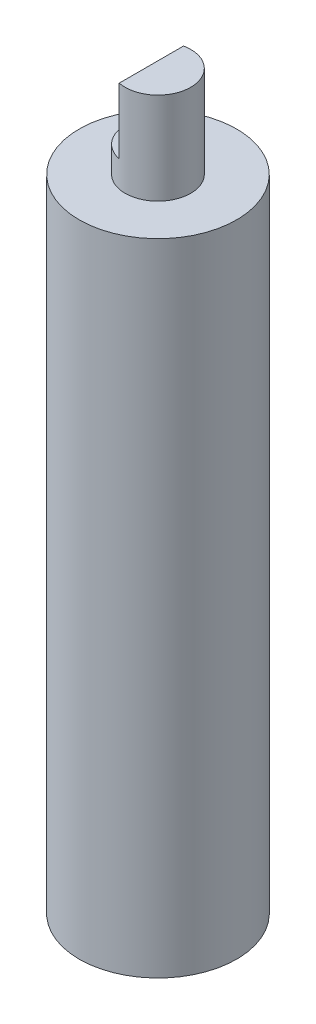
ISO-10303-21;
HEADER;
FILE_DESCRIPTION(('STEP AP214'),'2;1');
FILE_NAME('part.step','',(''),(''),'','','');
FILE_SCHEMA(('AUTOMOTIVE_DESIGN { 1 0 10303 214 1 1 1 1 }'));
ENDSEC;
DATA;
#1=APPLICATION_CONTEXT('core data for automotive mechanical design processes');
#2=APPLICATION_PROTOCOL_DEFINITION('international standard','automotive_design',2000,#1);
#3=PRODUCT_CONTEXT('',#1,'mechanical');
#4=PRODUCT('Part','Part','',(#3));
#5=PRODUCT_RELATED_PRODUCT_CATEGORY('part','',(#4));
#6=PRODUCT_DEFINITION_FORMATION('','',#4);
#7=PRODUCT_DEFINITION_CONTEXT('part definition',#1,'design');
#8=PRODUCT_DEFINITION('design','',#6,#7);
#9=PRODUCT_DEFINITION_SHAPE('','',#8);
#10=(LENGTH_UNIT() NAMED_UNIT(*) SI_UNIT(.MILLI.,.METRE.));
#11=(NAMED_UNIT(*) PLANE_ANGLE_UNIT() SI_UNIT($,.RADIAN.));
#12=(NAMED_UNIT(*) SI_UNIT($,.STERADIAN.) SOLID_ANGLE_UNIT());
#13=UNCERTAINTY_MEASURE_WITH_UNIT(LENGTH_MEASURE(1.E-05),#10,'distance_accuracy_value','');
#14=(GEOMETRIC_REPRESENTATION_CONTEXT(3) GLOBAL_UNCERTAINTY_ASSIGNED_CONTEXT((#13)) GLOBAL_UNIT_ASSIGNED_CONTEXT((#10,
#11,#12)) REPRESENTATION_CONTEXT('',''));
#15=CARTESIAN_POINT('',(0.,0.,0.));
#16=DIRECTION('',(0.,0.,1.));
#17=DIRECTION('',(1.,0.,0.));
#18=AXIS2_PLACEMENT_3D('',#15,#16,#17);
#19=CARTESIAN_POINT('',(0.,42.9,-23.8716187755818));
#20=DIRECTION('',(0.,-1.,0.));
#21=DIRECTION('',(0.,0.,-1.));
#22=AXIS2_PLACEMENT_3D('',#19,#20,#21);
#23=PLANE('',#22);
#24=CARTESIAN_POINT('',(0.,42.9,-22.6216187755818));
#25=DIRECTION('',(0.,1.,0.));
#26=DIRECTION('',(0.,0.,1.));
#27=AXIS2_PLACEMENT_3D('',#24,#25,#26);
#28=CIRCLE('',#27,1.25);
#29=CARTESIAN_POINT('',(-0.249999999999995,42.9,-21.3968739041902));
#30=VERTEX_POINT('',#29);
#31=CARTESIAN_POINT('',(-0.249999999999996,42.9,-23.8463636469734));
#32=VERTEX_POINT('',#31);
#33=EDGE_CURVE('E83',#30,#32,#28,.T.);
#34=ORIENTED_EDGE('',*,*,#33,.T.);
#35=DIRECTION('',(0.,0.,-1.));
#36=VECTOR('',#35,1.);
#37=CARTESIAN_POINT('',(-0.249999999999996,42.9,-23.8463636469734));
#38=LINE('',#37,#36);
#39=EDGE_CURVE('E74',#30,#32,#38,.T.);
#40=ORIENTED_EDGE('',*,*,#39,.F.);
#41=EDGE_LOOP('',(#34,#40));
#42=FACE_BOUND('',#41,.T.);
#43=ADVANCED_FACE('F45',(#42),#23,.F.);
#44=CARTESIAN_POINT('',(0.,15.,-22.6216187755818));
#45=DIRECTION('',(0.,1.,0.));
#46=DIRECTION('',(0.,0.,1.));
#47=AXIS2_PLACEMENT_3D('',#44,#45,#46);
#48=PLANE('',#47);
#49=CARTESIAN_POINT('',(0.,15.,-22.6216187755818));
#50=DIRECTION('',(0.,1.,0.));
#51=DIRECTION('',(0.,0.,1.));
#52=AXIS2_PLACEMENT_3D('',#49,#50,#51);
#53=CIRCLE('',#52,3.);
#54=CARTESIAN_POINT('',(0.,15.,-19.6216187755818));
#55=VERTEX_POINT('',#54);
#56=EDGE_CURVE('E11',#55,#55,#53,.T.);
#57=ORIENTED_EDGE('',*,*,#56,.F.);
#58=EDGE_LOOP('',(#57));
#59=FACE_BOUND('',#58,.T.);
#60=ADVANCED_FACE('F105',(#59),#48,.F.);
#61=CARTESIAN_POINT('',(0.,42.9,-22.6216187755818));
#62=DIRECTION('',(0.,1.,0.));
#63=DIRECTION('',(0.,0.,1.));
#64=AXIS2_PLACEMENT_3D('',#61,#62,#63);
#65=CYLINDRICAL_SURFACE('',#64,3.);
#66=CARTESIAN_POINT('',(0.,39.4,-22.6216187755818));
#67=DIRECTION('',(0.,1.,0.));
#68=DIRECTION('',(0.,0.,1.));
#69=AXIS2_PLACEMENT_3D('',#66,#67,#68);
#70=CIRCLE('',#69,3.);
#71=CARTESIAN_POINT('',(0.,39.4,-19.6216187755818));
#72=VERTEX_POINT('',#71);
#73=EDGE_CURVE('E53',#72,#72,#70,.T.);
#74=ORIENTED_EDGE('',*,*,#73,.F.);
#75=EDGE_LOOP('',(#74));
#76=FACE_BOUND('',#75,.T.);
#77=ORIENTED_EDGE('',*,*,#56,.T.);
#78=EDGE_LOOP('',(#77));
#79=FACE_BOUND('',#78,.T.);
#80=ADVANCED_FACE('F102',(#76,#79),#65,.T.);
#81=CARTESIAN_POINT('',(0.,39.4,-25.6216187755818));
#82=DIRECTION('',(0.,-1.,0.));
#83=DIRECTION('',(0.,0.,-1.));
#84=AXIS2_PLACEMENT_3D('',#81,#82,#83);
#85=PLANE('',#84);
#86=CARTESIAN_POINT('',(0.,39.4,-22.6216187755818));
#87=DIRECTION('',(0.,1.,0.));
#88=DIRECTION('',(0.,0.,1.));
#89=AXIS2_PLACEMENT_3D('',#86,#87,#88);
#90=CIRCLE('',#89,1.25);
#91=CARTESIAN_POINT('',(0.,39.4,-21.3716187755818));
#92=VERTEX_POINT('',#91);
#93=EDGE_CURVE('E89',#92,#92,#90,.T.);
#94=ORIENTED_EDGE('',*,*,#93,.F.);
#95=EDGE_LOOP('',(#94));
#96=FACE_BOUND('',#95,.T.);
#97=ORIENTED_EDGE('',*,*,#73,.T.);
#98=EDGE_LOOP('',(#97));
#99=FACE_BOUND('',#98,.T.);
#100=ADVANCED_FACE('F100',(#96,#99),#85,.F.);
#101=CARTESIAN_POINT('',(0.,42.9,-22.6216187755818));
#102=DIRECTION('',(0.,1.,0.));
#103=DIRECTION('',(0.,0.,1.));
#104=AXIS2_PLACEMENT_3D('',#101,#102,#103);
#105=CYLINDRICAL_SURFACE('',#104,1.25);
#106=CARTESIAN_POINT('',(0.,40.4,-22.6216187755818));
#107=DIRECTION('',(0.,1.,0.));
#108=DIRECTION('',(0.,0.,1.));
#109=AXIS2_PLACEMENT_3D('',#106,#107,#108);
#110=CIRCLE('',#109,1.25);
#111=CARTESIAN_POINT('',(-0.249999999999996,40.4,-23.8463636469734));
#112=VERTEX_POINT('',#111);
#113=CARTESIAN_POINT('',(-0.249999999999995,40.4,-21.3968739041902));
#114=VERTEX_POINT('',#113);
#115=EDGE_CURVE('E64',#112,#114,#110,.T.);
#116=ORIENTED_EDGE('',*,*,#115,.F.);
#117=DIRECTION('',(0.,1.,0.));
#118=VECTOR('',#117,1.);
#119=CARTESIAN_POINT('',(-0.249999999999996,40.4,-23.8463636469734));
#120=LINE('',#119,#118);
#121=EDGE_CURVE('E79',#112,#32,#120,.T.);
#122=ORIENTED_EDGE('',*,*,#121,.T.);
#123=ORIENTED_EDGE('',*,*,#33,.F.);
#124=DIRECTION('',(0.,1.,0.));
#125=VECTOR('',#124,1.);
#126=CARTESIAN_POINT('',(-0.249999999999995,40.4,-21.3968739041902));
#127=LINE('',#126,#125);
#128=EDGE_CURVE('E71',#114,#30,#127,.T.);
#129=ORIENTED_EDGE('',*,*,#128,.F.);
#130=EDGE_LOOP('',(#116,#122,#123,#129));
#131=FACE_BOUND('',#130,.T.);
#132=ORIENTED_EDGE('',*,*,#93,.T.);
#133=EDGE_LOOP('',(#132));
#134=FACE_BOUND('',#133,.T.);
#135=ADVANCED_FACE('F86',(#131,#134),#105,.T.);
#136=CARTESIAN_POINT('',(-0.249999999999996,40.4,-23.8463636469734));
#137=DIRECTION('',(1.,0.,0.));
#138=DIRECTION('',(0.,0.,-1.));
#139=AXIS2_PLACEMENT_3D('',#136,#137,#138);
#140=PLANE('',#139);
#141=ORIENTED_EDGE('',*,*,#39,.T.);
#142=ORIENTED_EDGE('',*,*,#121,.F.);
#143=DIRECTION('',(0.,0.,-1.));
#144=VECTOR('',#143,1.);
#145=CARTESIAN_POINT('',(-0.249999999999996,40.4,-23.8463636469734));
#146=LINE('',#145,#144);
#147=EDGE_CURVE('E59',#114,#112,#146,.T.);
#148=ORIENTED_EDGE('',*,*,#147,.F.);
#149=ORIENTED_EDGE('',*,*,#128,.T.);
#150=EDGE_LOOP('',(#141,#142,#148,#149));
#151=FACE_BOUND('',#150,.T.);
#152=ADVANCED_FACE('F73',(#151),#140,.F.);
#153=CARTESIAN_POINT('',(0.,40.4,-22.6216187755818));
#154=DIRECTION('',(0.,1.,0.));
#155=DIRECTION('',(0.,0.,1.));
#156=AXIS2_PLACEMENT_3D('',#153,#154,#155);
#157=PLANE('',#156);
#158=ORIENTED_EDGE('',*,*,#115,.T.);
#159=ORIENTED_EDGE('',*,*,#147,.T.);
#160=EDGE_LOOP('',(#158,#159));
#161=FACE_BOUND('',#160,.T.);
#162=ADVANCED_FACE('F121',(#161),#157,.T.);
#163=CLOSED_SHELL('',(#43,#60,#80,#100,#135,#152,#162));
#164=MANIFOLD_SOLID_BREP('B2',#163);
#165=ADVANCED_BREP_SHAPE_REPRESENTATION('',(#18,#164),#14);
#166=SHAPE_DEFINITION_REPRESENTATION(#9,#165);
ENDSEC;
END-ISO-10303-21;
